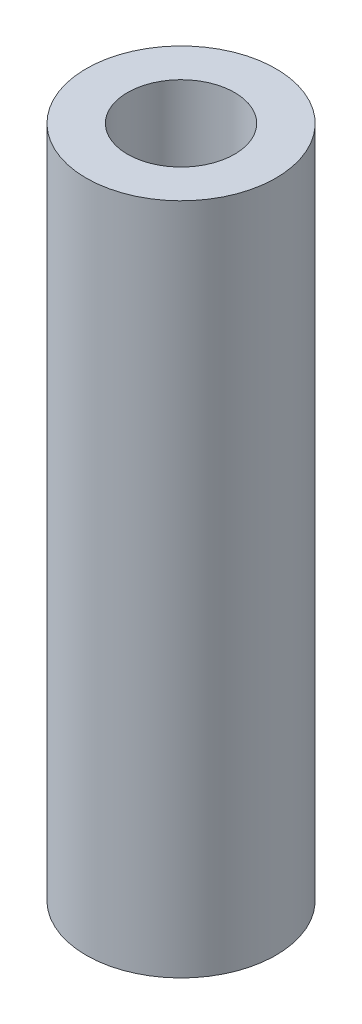
ISO-10303-21;
HEADER;
FILE_DESCRIPTION(('STEP AP214'),'2;1');
FILE_NAME('part.step','',(''),(''),'','','');
FILE_SCHEMA(('AUTOMOTIVE_DESIGN { 1 0 10303 214 1 1 1 1 }'));
ENDSEC;
DATA;
#1=APPLICATION_CONTEXT('core data for automotive mechanical design processes');
#2=APPLICATION_PROTOCOL_DEFINITION('international standard','automotive_design',2000,#1);
#3=PRODUCT_CONTEXT('',#1,'mechanical');
#4=PRODUCT('Part','Part','',(#3));
#5=PRODUCT_RELATED_PRODUCT_CATEGORY('part','',(#4));
#6=PRODUCT_DEFINITION_FORMATION('','',#4);
#7=PRODUCT_DEFINITION_CONTEXT('part definition',#1,'design');
#8=PRODUCT_DEFINITION('design','',#6,#7);
#9=PRODUCT_DEFINITION_SHAPE('','',#8);
#10=(LENGTH_UNIT() NAMED_UNIT(*) SI_UNIT(.MILLI.,.METRE.));
#11=(NAMED_UNIT(*) PLANE_ANGLE_UNIT() SI_UNIT($,.RADIAN.));
#12=(NAMED_UNIT(*) SI_UNIT($,.STERADIAN.) SOLID_ANGLE_UNIT());
#13=UNCERTAINTY_MEASURE_WITH_UNIT(LENGTH_MEASURE(1.E-05),#10,'distance_accuracy_value','');
#14=(GEOMETRIC_REPRESENTATION_CONTEXT(3) GLOBAL_UNCERTAINTY_ASSIGNED_CONTEXT((#13)) GLOBAL_UNIT_ASSIGNED_CONTEXT((#10,
#11,#12)) REPRESENTATION_CONTEXT('',''));
#15=CARTESIAN_POINT('',(0.,0.,0.));
#16=DIRECTION('',(0.,0.,1.));
#17=DIRECTION('',(1.,0.,0.));
#18=AXIS2_PLACEMENT_3D('',#15,#16,#17);
#19=CARTESIAN_POINT('',(0.,440.,0.));
#20=DIRECTION('',(0.,1.,0.));
#21=DIRECTION('',(0.,0.,1.));
#22=AXIS2_PLACEMENT_3D('',#19,#20,#21);
#23=PLANE('',#22);
#24=CARTESIAN_POINT('',(0.,440.,0.));
#25=DIRECTION('',(0.,1.,0.));
#26=DIRECTION('',(0.,0.,1.));
#27=AXIS2_PLACEMENT_3D('',#24,#25,#26);
#28=CIRCLE('',#27,62.);
#29=CARTESIAN_POINT('',(0.,440.,62.));
#30=VERTEX_POINT('',#29);
#31=EDGE_CURVE('E12',#30,#30,#28,.T.);
#32=ORIENTED_EDGE('',*,*,#31,.T.);
#33=EDGE_LOOP('',(#32));
#34=FACE_BOUND('',#33,.T.);
#35=CARTESIAN_POINT('',(0.,440.,0.));
#36=DIRECTION('',(0.,1.,0.));
#37=DIRECTION('',(0.,0.,1.));
#38=AXIS2_PLACEMENT_3D('',#35,#36,#37);
#39=CIRCLE('',#38,35.);
#40=CARTESIAN_POINT('',(0.,440.,35.));
#41=VERTEX_POINT('',#40);
#42=EDGE_CURVE('E67',#41,#41,#39,.T.);
#43=ORIENTED_EDGE('',*,*,#42,.F.);
#44=EDGE_LOOP('',(#43));
#45=FACE_BOUND('',#44,.T.);
#46=ADVANCED_FACE('F53',(#34,#45),#23,.T.);
#47=CARTESIAN_POINT('',(0.,0.,0.));
#48=DIRECTION('',(0.,1.,0.));
#49=DIRECTION('',(0.,0.,1.));
#50=AXIS2_PLACEMENT_3D('',#47,#48,#49);
#51=PLANE('',#50);
#52=CARTESIAN_POINT('',(0.,0.,0.));
#53=DIRECTION('',(0.,1.,0.));
#54=DIRECTION('',(0.,0.,1.));
#55=AXIS2_PLACEMENT_3D('',#52,#53,#54);
#56=CIRCLE('',#55,62.);
#57=CARTESIAN_POINT('',(0.,0.,62.));
#58=VERTEX_POINT('',#57);
#59=EDGE_CURVE('E57',#58,#58,#56,.T.);
#60=ORIENTED_EDGE('',*,*,#59,.F.);
#61=EDGE_LOOP('',(#60));
#62=FACE_BOUND('',#61,.T.);
#63=CARTESIAN_POINT('',(0.,0.,0.));
#64=DIRECTION('',(0.,1.,0.));
#65=DIRECTION('',(0.,0.,1.));
#66=AXIS2_PLACEMENT_3D('',#63,#64,#65);
#67=CIRCLE('',#66,35.);
#68=CARTESIAN_POINT('',(0.,0.,35.));
#69=VERTEX_POINT('',#68);
#70=EDGE_CURVE('E69',#69,#69,#67,.T.);
#71=ORIENTED_EDGE('',*,*,#70,.T.);
#72=EDGE_LOOP('',(#71));
#73=FACE_BOUND('',#72,.T.);
#74=ADVANCED_FACE('F82',(#62,#73),#51,.F.);
#75=CARTESIAN_POINT('',(0.,440.,0.));
#76=DIRECTION('',(0.,-1.,0.));
#77=DIRECTION('',(0.,0.,-1.));
#78=AXIS2_PLACEMENT_3D('',#75,#76,#77);
#79=CYLINDRICAL_SURFACE('',#78,62.);
#80=ORIENTED_EDGE('',*,*,#31,.F.);
#81=EDGE_LOOP('',(#80));
#82=FACE_BOUND('',#81,.T.);
#83=ORIENTED_EDGE('',*,*,#59,.T.);
#84=EDGE_LOOP('',(#83));
#85=FACE_BOUND('',#84,.T.);
#86=ADVANCED_FACE('F55',(#82,#85),#79,.T.);
#87=CARTESIAN_POINT('',(0.,440.,0.));
#88=DIRECTION('',(0.,-1.,0.));
#89=DIRECTION('',(0.,0.,-1.));
#90=AXIS2_PLACEMENT_3D('',#87,#88,#89);
#91=CYLINDRICAL_SURFACE('',#90,35.);
#92=ORIENTED_EDGE('',*,*,#42,.T.);
#93=EDGE_LOOP('',(#92));
#94=FACE_BOUND('',#93,.T.);
#95=ORIENTED_EDGE('',*,*,#70,.F.);
#96=EDGE_LOOP('',(#95));
#97=FACE_BOUND('',#96,.T.);
#98=ADVANCED_FACE('F78',(#94,#97),#91,.F.);
#99=CLOSED_SHELL('',(#46,#74,#86,#98));
#100=MANIFOLD_SOLID_BREP('B2',#99);
#101=ADVANCED_BREP_SHAPE_REPRESENTATION('',(#18,#100),#14);
#102=SHAPE_DEFINITION_REPRESENTATION(#9,#101);
ENDSEC;
END-ISO-10303-21;
